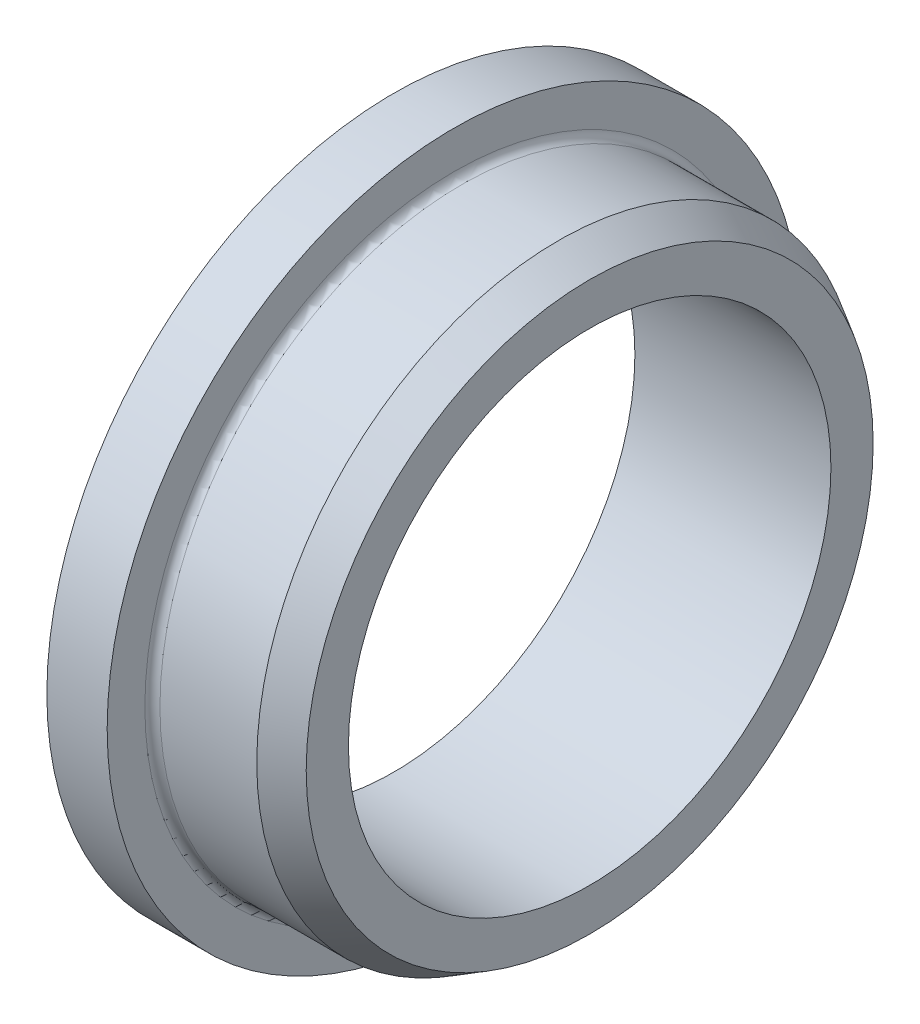
ISO-10303-21;
HEADER;
FILE_DESCRIPTION(('STEP AP214'),'2;1');
FILE_NAME('part.step','',(''),(''),'','','');
FILE_SCHEMA(('AUTOMOTIVE_DESIGN { 1 0 10303 214 1 1 1 1 }'));
ENDSEC;
DATA;
#1=APPLICATION_CONTEXT('core data for automotive mechanical design processes');
#2=APPLICATION_PROTOCOL_DEFINITION('international standard','automotive_design',2000,#1);
#3=PRODUCT_CONTEXT('',#1,'mechanical');
#4=PRODUCT('Part','Part','',(#3));
#5=PRODUCT_RELATED_PRODUCT_CATEGORY('part','',(#4));
#6=PRODUCT_DEFINITION_FORMATION('','',#4);
#7=PRODUCT_DEFINITION_CONTEXT('part definition',#1,'design');
#8=PRODUCT_DEFINITION('design','',#6,#7);
#9=PRODUCT_DEFINITION_SHAPE('','',#8);
#10=(LENGTH_UNIT() NAMED_UNIT(*) SI_UNIT(.MILLI.,.METRE.));
#11=(NAMED_UNIT(*) PLANE_ANGLE_UNIT() SI_UNIT($,.RADIAN.));
#12=(NAMED_UNIT(*) SI_UNIT($,.STERADIAN.) SOLID_ANGLE_UNIT());
#13=UNCERTAINTY_MEASURE_WITH_UNIT(LENGTH_MEASURE(1.E-05),#10,'distance_accuracy_value','');
#14=(GEOMETRIC_REPRESENTATION_CONTEXT(3) GLOBAL_UNCERTAINTY_ASSIGNED_CONTEXT((#13)) GLOBAL_UNIT_ASSIGNED_CONTEXT((#10,
#11,#12)) REPRESENTATION_CONTEXT('',''));
#15=CARTESIAN_POINT('',(0.,0.,0.));
#16=DIRECTION('',(0.,0.,1.));
#17=DIRECTION('',(1.,0.,0.));
#18=AXIS2_PLACEMENT_3D('',#15,#16,#17);
#19=CARTESIAN_POINT('',(0.,23.,0.));
#20=DIRECTION('',(1.,0.,0.));
#21=DIRECTION('',(0.,0.,-1.));
#22=AXIS2_PLACEMENT_3D('',#19,#20,#21);
#23=PLANE('',#22);
#24=CARTESIAN_POINT('',(0.,0.,0.));
#25=DIRECTION('',(-1.,0.,0.));
#26=DIRECTION('',(0.,0.,1.));
#27=AXIS2_PLACEMENT_3D('',#24,#25,#26);
#28=CIRCLE('',#27,16.);
#29=CARTESIAN_POINT('',(0.,0.,16.));
#30=VERTEX_POINT('',#29);
#31=EDGE_CURVE('E70',#30,#30,#28,.T.);
#32=ORIENTED_EDGE('',*,*,#31,.F.);
#33=EDGE_LOOP('',(#32));
#34=FACE_BOUND('',#33,.T.);
#35=CARTESIAN_POINT('',(0.,0.,0.));
#36=DIRECTION('',(-1.,0.,0.));
#37=DIRECTION('',(0.,0.,1.));
#38=AXIS2_PLACEMENT_3D('',#35,#36,#37);
#39=CIRCLE('',#38,23.);
#40=CARTESIAN_POINT('',(0.,0.,23.));
#41=VERTEX_POINT('',#40);
#42=EDGE_CURVE('E82',#41,#41,#39,.T.);
#43=ORIENTED_EDGE('',*,*,#42,.T.);
#44=EDGE_LOOP('',(#43));
#45=FACE_BOUND('',#44,.T.);
#46=ADVANCED_FACE('F45',(#34,#45),#23,.F.);
#47=CARTESIAN_POINT('',(0.,0.,0.));
#48=DIRECTION('',(-1.,0.,0.));
#49=DIRECTION('',(0.,0.,1.));
#50=AXIS2_PLACEMENT_3D('',#47,#48,#49);
#51=CYLINDRICAL_SURFACE('',#50,16.);
#52=CARTESIAN_POINT('',(13.,0.,0.));
#53=DIRECTION('',(-1.,0.,0.));
#54=DIRECTION('',(0.,0.,1.));
#55=AXIS2_PLACEMENT_3D('',#52,#53,#54);
#56=CIRCLE('',#55,16.);
#57=CARTESIAN_POINT('',(13.,0.,16.));
#58=VERTEX_POINT('',#57);
#59=EDGE_CURVE('E74',#58,#58,#56,.T.);
#60=ORIENTED_EDGE('',*,*,#59,.F.);
#61=EDGE_LOOP('',(#60));
#62=FACE_BOUND('',#61,.T.);
#63=ORIENTED_EDGE('',*,*,#31,.T.);
#64=EDGE_LOOP('',(#63));
#65=FACE_BOUND('',#64,.T.);
#66=ADVANCED_FACE('F107',(#62,#65),#51,.F.);
#67=CARTESIAN_POINT('',(13.,16.,0.));
#68=DIRECTION('',(-1.,0.,0.));
#69=DIRECTION('',(0.,0.,1.));
#70=AXIS2_PLACEMENT_3D('',#67,#68,#69);
#71=PLANE('',#70);
#72=CARTESIAN_POINT('',(13.,0.,0.));
#73=DIRECTION('',(-1.,0.,0.));
#74=DIRECTION('',(0.,0.,1.));
#75=AXIS2_PLACEMENT_3D('',#72,#73,#74);
#76=CIRCLE('',#75,18.8);
#77=CARTESIAN_POINT('',(13.,0.,18.8));
#78=VERTEX_POINT('',#77);
#79=EDGE_CURVE('E10',#78,#78,#76,.F.);
#80=ORIENTED_EDGE('',*,*,#79,.T.);
#81=EDGE_LOOP('',(#80));
#82=FACE_BOUND('',#81,.T.);
#83=ORIENTED_EDGE('',*,*,#59,.T.);
#84=EDGE_LOOP('',(#83));
#85=FACE_BOUND('',#84,.T.);
#86=ADVANCED_FACE('F104',(#82,#85),#71,.F.);
#87=CARTESIAN_POINT('',(0.,0.,0.));
#88=DIRECTION('',(-1.,0.,0.));
#89=DIRECTION('',(0.,0.,1.));
#90=AXIS2_PLACEMENT_3D('',#87,#88,#89);
#91=CYLINDRICAL_SURFACE('',#90,20.);
#92=CARTESIAN_POINT('',(10.9215390309173,0.,0.));
#93=DIRECTION('',(-1.,0.,0.));
#94=DIRECTION('',(0.,0.,1.));
#95=AXIS2_PLACEMENT_3D('',#92,#93,#94);
#96=CIRCLE('',#95,20.);
#97=CARTESIAN_POINT('',(10.9215390309173,0.,20.));
#98=VERTEX_POINT('',#97);
#99=EDGE_CURVE('E54',#98,#98,#96,.T.);
#100=ORIENTED_EDGE('',*,*,#99,.T.);
#101=EDGE_LOOP('',(#100));
#102=FACE_BOUND('',#101,.T.);
#103=CARTESIAN_POINT('',(4.5,0.,0.));
#104=DIRECTION('',(-1.,0.,0.));
#105=DIRECTION('',(0.,0.,1.));
#106=AXIS2_PLACEMENT_3D('',#103,#104,#105);
#107=CIRCLE('',#106,20.);
#108=CARTESIAN_POINT('',(4.5,0.,20.));
#109=VERTEX_POINT('',#108);
#110=EDGE_CURVE('E59',#109,#109,#107,.F.);
#111=ORIENTED_EDGE('',*,*,#110,.T.);
#112=EDGE_LOOP('',(#111));
#113=FACE_BOUND('',#112,.T.);
#114=ADVANCED_FACE('F97',(#102,#113),#91,.T.);
#115=CARTESIAN_POINT('',(4.,20.,0.));
#116=DIRECTION('',(-1.,0.,0.));
#117=DIRECTION('',(0.,0.,1.));
#118=AXIS2_PLACEMENT_3D('',#115,#116,#117);
#119=PLANE('',#118);
#120=CARTESIAN_POINT('',(4.,0.,0.));
#121=DIRECTION('',(-1.,0.,0.));
#122=DIRECTION('',(0.,0.,1.));
#123=AXIS2_PLACEMENT_3D('',#120,#121,#122);
#124=CIRCLE('',#123,20.5);
#125=CARTESIAN_POINT('',(4.,0.,20.5));
#126=VERTEX_POINT('',#125);
#127=EDGE_CURVE('E64',#126,#126,#124,.T.);
#128=ORIENTED_EDGE('',*,*,#127,.T.);
#129=EDGE_LOOP('',(#128));
#130=FACE_BOUND('',#129,.T.);
#131=CARTESIAN_POINT('',(4.,0.,0.));
#132=DIRECTION('',(-1.,0.,0.));
#133=DIRECTION('',(0.,0.,1.));
#134=AXIS2_PLACEMENT_3D('',#131,#132,#133);
#135=CIRCLE('',#134,23.);
#136=CARTESIAN_POINT('',(4.,0.,23.));
#137=VERTEX_POINT('',#136);
#138=EDGE_CURVE('E78',#137,#137,#135,.T.);
#139=ORIENTED_EDGE('',*,*,#138,.F.);
#140=EDGE_LOOP('',(#139));
#141=FACE_BOUND('',#140,.T.);
#142=ADVANCED_FACE('F92',(#130,#141),#119,.F.);
#143=CARTESIAN_POINT('',(0.,0.,0.));
#144=DIRECTION('',(-1.,0.,0.));
#145=DIRECTION('',(0.,0.,1.));
#146=AXIS2_PLACEMENT_3D('',#143,#144,#145);
#147=CYLINDRICAL_SURFACE('',#146,23.);
#148=ORIENTED_EDGE('',*,*,#42,.F.);
#149=EDGE_LOOP('',(#148));
#150=FACE_BOUND('',#149,.T.);
#151=ORIENTED_EDGE('',*,*,#138,.T.);
#152=EDGE_LOOP('',(#151));
#153=FACE_BOUND('',#152,.T.);
#154=ADVANCED_FACE('F88',(#150,#153),#147,.T.);
#155=CARTESIAN_POINT('',(4.5,0.,0.));
#156=DIRECTION('',(-1.,0.,0.));
#157=DIRECTION('',(0.,0.,1.));
#158=AXIS2_PLACEMENT_3D('',#155,#156,#157);
#159=TOROIDAL_SURFACE('',#158,20.5,0.5);
#160=ORIENTED_EDGE('',*,*,#110,.F.);
#161=EDGE_LOOP('',(#160));
#162=FACE_BOUND('',#161,.T.);
#163=ORIENTED_EDGE('',*,*,#127,.F.);
#164=EDGE_LOOP('',(#163));
#165=FACE_BOUND('',#164,.T.);
#166=ADVANCED_FACE('F91',(#162,#165),#159,.F.);
#167=CARTESIAN_POINT('',(10.9215390309173,0.,0.));
#168=DIRECTION('',(-1.,0.,0.));
#169=DIRECTION('',(0.,0.,1.));
#170=AXIS2_PLACEMENT_3D('',#167,#168,#169);
#171=CONICAL_SURFACE('',#170,20.,0.523598775598301);
#172=ORIENTED_EDGE('',*,*,#79,.F.);
#173=EDGE_LOOP('',(#172));
#174=FACE_BOUND('',#173,.T.);
#175=ORIENTED_EDGE('',*,*,#99,.F.);
#176=EDGE_LOOP('',(#175));
#177=FACE_BOUND('',#176,.T.);
#178=ADVANCED_FACE('F48',(#174,#177),#171,.T.);
#179=CLOSED_SHELL('',(#46,#66,#86,#114,#142,#154,#166,#178));
#180=MANIFOLD_SOLID_BREP('B2',#179);
#181=ADVANCED_BREP_SHAPE_REPRESENTATION('',(#18,#180),#14);
#182=SHAPE_DEFINITION_REPRESENTATION(#9,#181);
ENDSEC;
END-ISO-10303-21;
